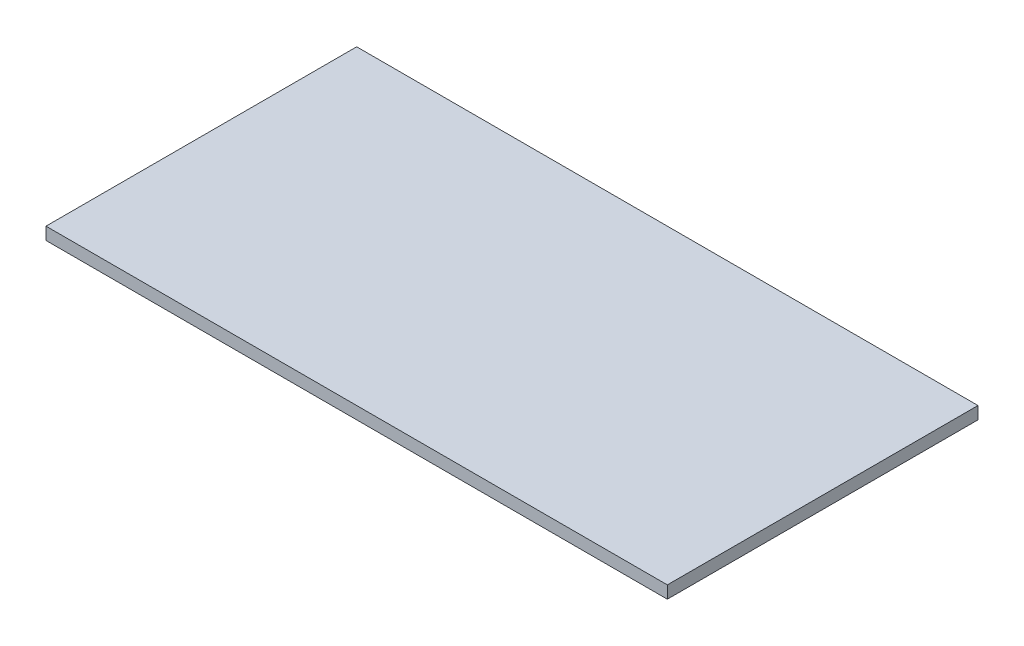
ISO-10303-21;
HEADER;
FILE_DESCRIPTION(('STEP AP214'),'2;1');
FILE_NAME('part.step','',(''),(''),'','','');
FILE_SCHEMA(('AUTOMOTIVE_DESIGN { 1 0 10303 214 1 1 1 1 }'));
ENDSEC;
DATA;
#1=APPLICATION_CONTEXT('core data for automotive mechanical design processes');
#2=APPLICATION_PROTOCOL_DEFINITION('international standard','automotive_design',2000,#1);
#3=PRODUCT_CONTEXT('',#1,'mechanical');
#4=PRODUCT('Part','Part','',(#3));
#5=PRODUCT_RELATED_PRODUCT_CATEGORY('part','',(#4));
#6=PRODUCT_DEFINITION_FORMATION('','',#4);
#7=PRODUCT_DEFINITION_CONTEXT('part definition',#1,'design');
#8=PRODUCT_DEFINITION('design','',#6,#7);
#9=PRODUCT_DEFINITION_SHAPE('','',#8);
#10=(LENGTH_UNIT() NAMED_UNIT(*) SI_UNIT(.MILLI.,.METRE.));
#11=(NAMED_UNIT(*) PLANE_ANGLE_UNIT() SI_UNIT($,.RADIAN.));
#12=(NAMED_UNIT(*) SI_UNIT($,.STERADIAN.) SOLID_ANGLE_UNIT());
#13=UNCERTAINTY_MEASURE_WITH_UNIT(LENGTH_MEASURE(1.E-05),#10,'distance_accuracy_value','');
#14=(GEOMETRIC_REPRESENTATION_CONTEXT(3) GLOBAL_UNCERTAINTY_ASSIGNED_CONTEXT((#13)) GLOBAL_UNIT_ASSIGNED_CONTEXT((#10,
#11,#12)) REPRESENTATION_CONTEXT('',''));
#15=CARTESIAN_POINT('',(0.,0.,0.));
#16=DIRECTION('',(0.,0.,1.));
#17=DIRECTION('',(1.,0.,0.));
#18=AXIS2_PLACEMENT_3D('',#15,#16,#17);
#19=CARTESIAN_POINT('',(0.,4.,0.));
#20=DIRECTION('',(1.,0.,0.));
#21=DIRECTION('',(0.,0.,-1.));
#22=AXIS2_PLACEMENT_3D('',#19,#20,#21);
#23=PLANE('',#22);
#24=DIRECTION('',(0.,0.,1.));
#25=VECTOR('',#24,1.);
#26=CARTESIAN_POINT('',(0.,0.,0.));
#27=LINE('',#26,#25);
#28=CARTESIAN_POINT('',(0.,0.,-100.));
#29=VERTEX_POINT('',#28);
#30=CARTESIAN_POINT('',(0.,0.,0.));
#31=VERTEX_POINT('',#30);
#32=EDGE_CURVE('E96',#29,#31,#27,.T.);
#33=ORIENTED_EDGE('',*,*,#32,.T.);
#34=DIRECTION('',(0.,-1.,0.));
#35=VECTOR('',#34,1.);
#36=CARTESIAN_POINT('',(0.,4.,0.));
#37=LINE('',#36,#35);
#38=CARTESIAN_POINT('',(0.,4.,0.));
#39=VERTEX_POINT('',#38);
#40=EDGE_CURVE('E11',#39,#31,#37,.T.);
#41=ORIENTED_EDGE('',*,*,#40,.F.);
#42=DIRECTION('',(0.,0.,1.));
#43=VECTOR('',#42,1.);
#44=CARTESIAN_POINT('',(0.,4.,0.));
#45=LINE('',#44,#43);
#46=CARTESIAN_POINT('',(0.,4.,-100.));
#47=VERTEX_POINT('',#46);
#48=EDGE_CURVE('E84',#47,#39,#45,.T.);
#49=ORIENTED_EDGE('',*,*,#48,.F.);
#50=DIRECTION('',(0.,-1.,0.));
#51=VECTOR('',#50,1.);
#52=CARTESIAN_POINT('',(0.,4.,-100.));
#53=LINE('',#52,#51);
#54=EDGE_CURVE('E92',#47,#29,#53,.T.);
#55=ORIENTED_EDGE('',*,*,#54,.T.);
#56=EDGE_LOOP('',(#33,#41,#49,#55));
#57=FACE_BOUND('',#56,.T.);
#58=ADVANCED_FACE('F33',(#57),#23,.F.);
#59=CARTESIAN_POINT('',(0.,4.,0.));
#60=DIRECTION('',(0.,0.,-1.));
#61=DIRECTION('',(-1.,0.,0.));
#62=AXIS2_PLACEMENT_3D('',#59,#60,#61);
#63=PLANE('',#62);
#64=DIRECTION('',(1.,0.,0.));
#65=VECTOR('',#64,1.);
#66=CARTESIAN_POINT('',(0.,0.,0.));
#67=LINE('',#66,#65);
#68=CARTESIAN_POINT('',(200.,0.,0.));
#69=VERTEX_POINT('',#68);
#70=EDGE_CURVE('E88',#31,#69,#67,.T.);
#71=ORIENTED_EDGE('',*,*,#70,.T.);
#72=DIRECTION('',(0.,-1.,0.));
#73=VECTOR('',#72,1.);
#74=CARTESIAN_POINT('',(200.,4.,0.));
#75=LINE('',#74,#73);
#76=CARTESIAN_POINT('',(200.,4.,0.));
#77=VERTEX_POINT('',#76);
#78=EDGE_CURVE('E41',#77,#69,#75,.T.);
#79=ORIENTED_EDGE('',*,*,#78,.F.);
#80=DIRECTION('',(1.,0.,0.));
#81=VECTOR('',#80,1.);
#82=CARTESIAN_POINT('',(0.,4.,0.));
#83=LINE('',#82,#81);
#84=EDGE_CURVE('E79',#39,#77,#83,.T.);
#85=ORIENTED_EDGE('',*,*,#84,.F.);
#86=ORIENTED_EDGE('',*,*,#40,.T.);
#87=EDGE_LOOP('',(#71,#79,#85,#86));
#88=FACE_BOUND('',#87,.T.);
#89=ADVANCED_FACE('F87',(#88),#63,.F.);
#90=CARTESIAN_POINT('',(200.,4.,0.));
#91=DIRECTION('',(-1.,0.,0.));
#92=DIRECTION('',(0.,0.,1.));
#93=AXIS2_PLACEMENT_3D('',#90,#91,#92);
#94=PLANE('',#93);
#95=DIRECTION('',(0.,0.,-1.));
#96=VECTOR('',#95,1.);
#97=CARTESIAN_POINT('',(200.,0.,0.));
#98=LINE('',#97,#96);
#99=CARTESIAN_POINT('',(200.,0.,-100.));
#100=VERTEX_POINT('',#99);
#101=EDGE_CURVE('E66',#69,#100,#98,.T.);
#102=ORIENTED_EDGE('',*,*,#101,.T.);
#103=DIRECTION('',(0.,-1.,0.));
#104=VECTOR('',#103,1.);
#105=CARTESIAN_POINT('',(200.,4.,-100.));
#106=LINE('',#105,#104);
#107=CARTESIAN_POINT('',(200.,4.,-100.));
#108=VERTEX_POINT('',#107);
#109=EDGE_CURVE('E89',#108,#100,#106,.T.);
#110=ORIENTED_EDGE('',*,*,#109,.F.);
#111=DIRECTION('',(0.,0.,-1.));
#112=VECTOR('',#111,1.);
#113=CARTESIAN_POINT('',(200.,4.,0.));
#114=LINE('',#113,#112);
#115=EDGE_CURVE('E82',#77,#108,#114,.T.);
#116=ORIENTED_EDGE('',*,*,#115,.F.);
#117=ORIENTED_EDGE('',*,*,#78,.T.);
#118=EDGE_LOOP('',(#102,#110,#116,#117));
#119=FACE_BOUND('',#118,.T.);
#120=ADVANCED_FACE('F90',(#119),#94,.F.);
#121=CARTESIAN_POINT('',(0.,4.,-100.));
#122=DIRECTION('',(0.,0.,1.));
#123=DIRECTION('',(1.,0.,0.));
#124=AXIS2_PLACEMENT_3D('',#121,#122,#123);
#125=PLANE('',#124);
#126=DIRECTION('',(-1.,0.,0.));
#127=VECTOR('',#126,1.);
#128=CARTESIAN_POINT('',(0.,0.,-100.));
#129=LINE('',#128,#127);
#130=EDGE_CURVE('E72',#100,#29,#129,.T.);
#131=ORIENTED_EDGE('',*,*,#130,.T.);
#132=ORIENTED_EDGE('',*,*,#54,.F.);
#133=DIRECTION('',(-1.,0.,0.));
#134=VECTOR('',#133,1.);
#135=CARTESIAN_POINT('',(0.,4.,-100.));
#136=LINE('',#135,#134);
#137=EDGE_CURVE('E49',#108,#47,#136,.T.);
#138=ORIENTED_EDGE('',*,*,#137,.F.);
#139=ORIENTED_EDGE('',*,*,#109,.T.);
#140=EDGE_LOOP('',(#131,#132,#138,#139));
#141=FACE_BOUND('',#140,.T.);
#142=ADVANCED_FACE('F103',(#141),#125,.F.);
#143=CARTESIAN_POINT('',(0.,4.,0.));
#144=DIRECTION('',(0.,-1.,0.));
#145=DIRECTION('',(0.,0.,-1.));
#146=AXIS2_PLACEMENT_3D('',#143,#144,#145);
#147=PLANE('',#146);
#148=ORIENTED_EDGE('',*,*,#48,.T.);
#149=ORIENTED_EDGE('',*,*,#84,.T.);
#150=ORIENTED_EDGE('',*,*,#115,.T.);
#151=ORIENTED_EDGE('',*,*,#137,.T.);
#152=EDGE_LOOP('',(#148,#149,#150,#151));
#153=FACE_BOUND('',#152,.T.);
#154=ADVANCED_FACE('F80',(#153),#147,.F.);
#155=CARTESIAN_POINT('',(0.,0.,0.));
#156=DIRECTION('',(0.,-1.,0.));
#157=DIRECTION('',(0.,0.,-1.));
#158=AXIS2_PLACEMENT_3D('',#155,#156,#157);
#159=PLANE('',#158);
#160=ORIENTED_EDGE('',*,*,#32,.F.);
#161=ORIENTED_EDGE('',*,*,#130,.F.);
#162=ORIENTED_EDGE('',*,*,#101,.F.);
#163=ORIENTED_EDGE('',*,*,#70,.F.);
#164=EDGE_LOOP('',(#160,#161,#162,#163));
#165=FACE_BOUND('',#164,.T.);
#166=ADVANCED_FACE('F106',(#165),#159,.T.);
#167=CLOSED_SHELL('',(#58,#89,#120,#142,#154,#166));
#168=MANIFOLD_SOLID_BREP('B2',#167);
#169=ADVANCED_BREP_SHAPE_REPRESENTATION('',(#18,#168),#14);
#170=SHAPE_DEFINITION_REPRESENTATION(#9,#169);
ENDSEC;
END-ISO-10303-21;
